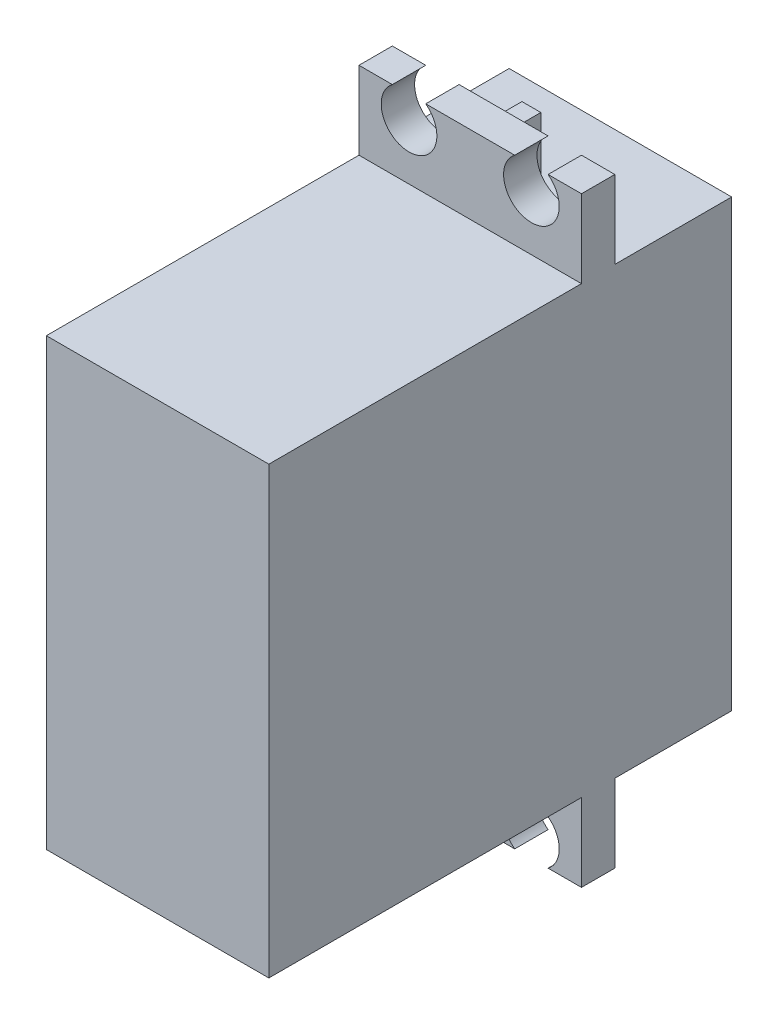
ISO-10303-21;
HEADER;
FILE_DESCRIPTION(('STEP AP214'),'2;1');
FILE_NAME('part.step','',(''),(''),'','','');
FILE_SCHEMA(('AUTOMOTIVE_DESIGN { 1 0 10303 214 1 1 1 1 }'));
ENDSEC;
DATA;
#1=APPLICATION_CONTEXT('core data for automotive mechanical design processes');
#2=APPLICATION_PROTOCOL_DEFINITION('international standard','automotive_design',2000,#1);
#3=PRODUCT_CONTEXT('',#1,'mechanical');
#4=PRODUCT('Part','Part','',(#3));
#5=PRODUCT_RELATED_PRODUCT_CATEGORY('part','',(#4));
#6=PRODUCT_DEFINITION_FORMATION('','',#4);
#7=PRODUCT_DEFINITION_CONTEXT('part definition',#1,'design');
#8=PRODUCT_DEFINITION('design','',#6,#7);
#9=PRODUCT_DEFINITION_SHAPE('','',#8);
#10=(LENGTH_UNIT() NAMED_UNIT(*) SI_UNIT(.MILLI.,.METRE.));
#11=(NAMED_UNIT(*) PLANE_ANGLE_UNIT() SI_UNIT($,.RADIAN.));
#12=(NAMED_UNIT(*) SI_UNIT($,.STERADIAN.) SOLID_ANGLE_UNIT());
#13=UNCERTAINTY_MEASURE_WITH_UNIT(LENGTH_MEASURE(1.E-05),#10,'distance_accuracy_value','');
#14=(GEOMETRIC_REPRESENTATION_CONTEXT(3) GLOBAL_UNCERTAINTY_ASSIGNED_CONTEXT((#13)) GLOBAL_UNIT_ASSIGNED_CONTEXT((#10,
#11,#12)) REPRESENTATION_CONTEXT('',''));
#15=CARTESIAN_POINT('',(0.,0.,0.));
#16=DIRECTION('',(0.,0.,1.));
#17=DIRECTION('',(1.,0.,0.));
#18=AXIS2_PLACEMENT_3D('',#15,#16,#17);
#19=CARTESIAN_POINT('',(-10.,-20.,41.6));
#20=DIRECTION('',(0.,1.,0.));
#21=DIRECTION('',(0.,0.,1.));
#22=AXIS2_PLACEMENT_3D('',#19,#20,#21);
#23=PLANE('',#22);
#24=DIRECTION('',(0.,0.,1.));
#25=VECTOR('',#24,1.);
#26=CARTESIAN_POINT('',(-0.850000000000004,-20.,8.));
#27=LINE('',#26,#25);
#28=CARTESIAN_POINT('',(-0.850000000000004,-20.,8.));
#29=VERTEX_POINT('',#28);
#30=CARTESIAN_POINT('',(-0.850000000000004,-20.,10.5));
#31=VERTEX_POINT('',#30);
#32=EDGE_CURVE('E233',#29,#31,#27,.T.);
#33=ORIENTED_EDGE('',*,*,#32,.T.);
#34=DIRECTION('',(-1.,0.,0.));
#35=VECTOR('',#34,1.);
#36=CARTESIAN_POINT('',(0.,-20.,10.5));
#37=LINE('',#36,#35);
#38=CARTESIAN_POINT('',(-10.,-20.,10.5));
#39=VERTEX_POINT('',#38);
#40=EDGE_CURVE('E293',#31,#39,#37,.T.);
#41=ORIENTED_EDGE('',*,*,#40,.T.);
#42=DIRECTION('',(0.,0.,-1.));
#43=VECTOR('',#42,1.);
#44=CARTESIAN_POINT('',(-10.,-20.,41.6));
#45=LINE('',#44,#43);
#46=CARTESIAN_POINT('',(-10.,-20.,0.));
#47=VERTEX_POINT('',#46);
#48=EDGE_CURVE('E416',#39,#47,#45,.T.);
#49=ORIENTED_EDGE('',*,*,#48,.T.);
#50=DIRECTION('',(1.,0.,0.));
#51=VECTOR('',#50,1.);
#52=CARTESIAN_POINT('',(-10.,-20.,0.));
#53=LINE('',#52,#51);
#54=CARTESIAN_POINT('',(10.,-20.,0.));
#55=VERTEX_POINT('',#54);
#56=EDGE_CURVE('E396',#47,#55,#53,.T.);
#57=ORIENTED_EDGE('',*,*,#56,.T.);
#58=DIRECTION('',(0.,0.,-1.));
#59=VECTOR('',#58,1.);
#60=CARTESIAN_POINT('',(10.,-20.,41.6));
#61=LINE('',#60,#59);
#62=CARTESIAN_POINT('',(10.,-20.,10.5));
#63=VERTEX_POINT('',#62);
#64=EDGE_CURVE('E402',#63,#55,#61,.T.);
#65=ORIENTED_EDGE('',*,*,#64,.F.);
#66=CARTESIAN_POINT('',(0.850000000000004,-20.,10.5));
#67=VERTEX_POINT('',#66);
#68=EDGE_CURVE('E294',#63,#67,#37,.T.);
#69=ORIENTED_EDGE('',*,*,#68,.T.);
#70=DIRECTION('',(0.,0.,1.));
#71=VECTOR('',#70,1.);
#72=CARTESIAN_POINT('',(0.850000000000004,-20.,8.));
#73=LINE('',#72,#71);
#74=CARTESIAN_POINT('',(0.850000000000004,-20.,8.));
#75=VERTEX_POINT('',#74);
#76=EDGE_CURVE('E240',#75,#67,#73,.T.);
#77=ORIENTED_EDGE('',*,*,#76,.F.);
#78=DIRECTION('',(1.,0.,0.));
#79=VECTOR('',#78,1.);
#80=CARTESIAN_POINT('',(-0.850000000000004,-20.,8.));
#81=LINE('',#80,#79);
#82=EDGE_CURVE('E224',#29,#75,#81,.T.);
#83=ORIENTED_EDGE('',*,*,#82,.F.);
#84=EDGE_LOOP('',(#33,#41,#49,#57,#65,#69,#77,#83));
#85=FACE_BOUND('',#84,.T.);
#86=ADVANCED_FACE('F34',(#85),#23,.F.);
#87=CARTESIAN_POINT('',(0.,0.,10.5));
#88=DIRECTION('',(0.,0.,-1.));
#89=DIRECTION('',(-1.,0.,0.));
#90=AXIS2_PLACEMENT_3D('',#87,#88,#89);
#91=PLANE('',#90);
#92=ORIENTED_EDGE('',*,*,#40,.F.);
#93=DIRECTION('',(0.,1.,0.));
#94=VECTOR('',#93,1.);
#95=CARTESIAN_POINT('',(-0.850000000000004,-20.,10.5));
#96=LINE('',#95,#94);
#97=CARTESIAN_POINT('',(-0.849999999999997,-26.,10.5));
#98=VERTEX_POINT('',#97);
#99=EDGE_CURVE('E236',#98,#31,#96,.T.);
#100=ORIENTED_EDGE('',*,*,#99,.F.);
#101=DIRECTION('',(-1.,0.,0.));
#102=VECTOR('',#101,1.);
#103=CARTESIAN_POINT('',(-0.849999999999997,-26.,10.5));
#104=LINE('',#103,#102);
#105=CARTESIAN_POINT('',(0.850000000000004,-26.,10.5));
#106=VERTEX_POINT('',#105);
#107=EDGE_CURVE('E230',#106,#98,#104,.T.);
#108=ORIENTED_EDGE('',*,*,#107,.F.);
#109=DIRECTION('',(0.,-1.,0.));
#110=VECTOR('',#109,1.);
#111=CARTESIAN_POINT('',(0.850000000000004,-20.,10.5));
#112=LINE('',#111,#110);
#113=EDGE_CURVE('E251',#67,#106,#112,.T.);
#114=ORIENTED_EDGE('',*,*,#113,.F.);
#115=ORIENTED_EDGE('',*,*,#68,.F.);
#116=DIRECTION('',(0.,1.,0.));
#117=VECTOR('',#116,1.);
#118=CARTESIAN_POINT('',(10.,0.,10.5));
#119=LINE('',#118,#117);
#120=CARTESIAN_POINT('',(10.,-27.,10.5));
#121=VERTEX_POINT('',#120);
#122=EDGE_CURVE('E296',#121,#63,#119,.T.);
#123=ORIENTED_EDGE('',*,*,#122,.F.);
#124=DIRECTION('',(-1.,0.,0.));
#125=VECTOR('',#124,1.);
#126=CARTESIAN_POINT('',(0.,-27.,10.5));
#127=LINE('',#126,#125);
#128=CARTESIAN_POINT('',(7.,-27.,10.5));
#129=VERTEX_POINT('',#128);
#130=EDGE_CURVE('E280',#121,#129,#127,.T.);
#131=ORIENTED_EDGE('',*,*,#130,.T.);
#132=CARTESIAN_POINT('',(5.5,-25.,10.5));
#133=DIRECTION('',(0.,0.,-1.));
#134=DIRECTION('',(-1.,0.,0.));
#135=AXIS2_PLACEMENT_3D('',#132,#133,#134);
#136=CIRCLE('',#135,2.5);
#137=CARTESIAN_POINT('',(4.,-27.,10.5));
#138=VERTEX_POINT('',#137);
#139=EDGE_CURVE('E283',#129,#138,#136,.F.);
#140=ORIENTED_EDGE('',*,*,#139,.T.);
#141=CARTESIAN_POINT('',(-4.,-27.,10.5));
#142=VERTEX_POINT('',#141);
#143=EDGE_CURVE('E286',#138,#142,#127,.T.);
#144=ORIENTED_EDGE('',*,*,#143,.T.);
#145=CARTESIAN_POINT('',(-5.5,-25.,10.5));
#146=DIRECTION('',(0.,0.,-1.));
#147=DIRECTION('',(-1.,0.,0.));
#148=AXIS2_PLACEMENT_3D('',#145,#146,#147);
#149=CIRCLE('',#148,2.5);
#150=CARTESIAN_POINT('',(-7.,-27.,10.5));
#151=VERTEX_POINT('',#150);
#152=EDGE_CURVE('E288',#142,#151,#149,.F.);
#153=ORIENTED_EDGE('',*,*,#152,.T.);
#154=CARTESIAN_POINT('',(-10.,-27.,10.5));
#155=VERTEX_POINT('',#154);
#156=EDGE_CURVE('E285',#151,#155,#127,.T.);
#157=ORIENTED_EDGE('',*,*,#156,.T.);
#158=DIRECTION('',(0.,1.,0.));
#159=VECTOR('',#158,1.);
#160=CARTESIAN_POINT('',(-10.,0.,10.5));
#161=LINE('',#160,#159);
#162=EDGE_CURVE('E290',#155,#39,#161,.T.);
#163=ORIENTED_EDGE('',*,*,#162,.T.);
#164=EDGE_LOOP('',(#92,#100,#108,#114,#115,#123,#131,#140,#144,#153,#157,#163));
#165=FACE_BOUND('',#164,.T.);
#166=ADVANCED_FACE('F501',(#165),#91,.T.);
#167=CARTESIAN_POINT('',(-10.,20.,41.6));
#168=DIRECTION('',(0.,-1.,0.));
#169=DIRECTION('',(0.,0.,-1.));
#170=AXIS2_PLACEMENT_3D('',#167,#168,#169);
#171=PLANE('',#170);
#172=DIRECTION('',(0.,0.,1.));
#173=VECTOR('',#172,1.);
#174=CARTESIAN_POINT('',(0.850000000000001,20.,8.));
#175=LINE('',#174,#173);
#176=CARTESIAN_POINT('',(0.850000000000001,20.,8.));
#177=VERTEX_POINT('',#176);
#178=CARTESIAN_POINT('',(0.850000000000001,20.,10.5));
#179=VERTEX_POINT('',#178);
#180=EDGE_CURVE('E276',#177,#179,#175,.T.);
#181=ORIENTED_EDGE('',*,*,#180,.T.);
#182=DIRECTION('',(1.,0.,0.));
#183=VECTOR('',#182,1.);
#184=CARTESIAN_POINT('',(0.,20.,10.5));
#185=LINE('',#184,#183);
#186=CARTESIAN_POINT('',(10.,20.,10.5));
#187=VERTEX_POINT('',#186);
#188=EDGE_CURVE('E346',#179,#187,#185,.T.);
#189=ORIENTED_EDGE('',*,*,#188,.T.);
#190=DIRECTION('',(0.,0.,-1.));
#191=VECTOR('',#190,1.);
#192=CARTESIAN_POINT('',(10.,20.,41.6));
#193=LINE('',#192,#191);
#194=CARTESIAN_POINT('',(10.,20.,0.));
#195=VERTEX_POINT('',#194);
#196=EDGE_CURVE('E423',#187,#195,#193,.T.);
#197=ORIENTED_EDGE('',*,*,#196,.T.);
#198=DIRECTION('',(-1.,0.,0.));
#199=VECTOR('',#198,1.);
#200=CARTESIAN_POINT('',(-10.,20.,0.));
#201=LINE('',#200,#199);
#202=CARTESIAN_POINT('',(-10.,20.,0.));
#203=VERTEX_POINT('',#202);
#204=EDGE_CURVE('E405',#195,#203,#201,.T.);
#205=ORIENTED_EDGE('',*,*,#204,.T.);
#206=DIRECTION('',(0.,0.,-1.));
#207=VECTOR('',#206,1.);
#208=CARTESIAN_POINT('',(-10.,20.,41.6));
#209=LINE('',#208,#207);
#210=CARTESIAN_POINT('',(-10.,20.,10.5));
#211=VERTEX_POINT('',#210);
#212=EDGE_CURVE('E420',#211,#203,#209,.T.);
#213=ORIENTED_EDGE('',*,*,#212,.F.);
#214=CARTESIAN_POINT('',(-0.850000000000001,20.,10.5));
#215=VERTEX_POINT('',#214);
#216=EDGE_CURVE('E347',#211,#215,#185,.T.);
#217=ORIENTED_EDGE('',*,*,#216,.T.);
#218=DIRECTION('',(0.,0.,1.));
#219=VECTOR('',#218,1.);
#220=CARTESIAN_POINT('',(-0.850000000000001,20.,8.));
#221=LINE('',#220,#219);
#222=CARTESIAN_POINT('',(-0.850000000000001,20.,8.));
#223=VERTEX_POINT('',#222);
#224=EDGE_CURVE('E274',#223,#215,#221,.T.);
#225=ORIENTED_EDGE('',*,*,#224,.F.);
#226=DIRECTION('',(-1.,0.,0.));
#227=VECTOR('',#226,1.);
#228=CARTESIAN_POINT('',(0.850000000000001,20.,8.));
#229=LINE('',#228,#227);
#230=EDGE_CURVE('E259',#177,#223,#229,.T.);
#231=ORIENTED_EDGE('',*,*,#230,.F.);
#232=EDGE_LOOP('',(#181,#189,#197,#205,#213,#217,#225,#231));
#233=FACE_BOUND('',#232,.T.);
#234=ADVANCED_FACE('F431',(#233),#171,.F.);
#235=CARTESIAN_POINT('',(0.,0.,10.5));
#236=DIRECTION('',(0.,0.,-1.));
#237=DIRECTION('',(-1.,0.,0.));
#238=AXIS2_PLACEMENT_3D('',#235,#236,#237);
#239=PLANE('',#238);
#240=ORIENTED_EDGE('',*,*,#188,.F.);
#241=DIRECTION('',(0.,-1.,0.));
#242=VECTOR('',#241,1.);
#243=CARTESIAN_POINT('',(0.85,26.,10.5));
#244=LINE('',#243,#242);
#245=CARTESIAN_POINT('',(0.85,26.,10.5));
#246=VERTEX_POINT('',#245);
#247=EDGE_CURVE('E239',#246,#179,#244,.T.);
#248=ORIENTED_EDGE('',*,*,#247,.F.);
#249=DIRECTION('',(1.,0.,0.));
#250=VECTOR('',#249,1.);
#251=CARTESIAN_POINT('',(0.85,26.,10.5));
#252=LINE('',#251,#250);
#253=CARTESIAN_POINT('',(-0.85,26.,10.5));
#254=VERTEX_POINT('',#253);
#255=EDGE_CURVE('E260',#254,#246,#252,.T.);
#256=ORIENTED_EDGE('',*,*,#255,.F.);
#257=DIRECTION('',(0.,1.,0.));
#258=VECTOR('',#257,1.);
#259=CARTESIAN_POINT('',(-0.85,26.,10.5));
#260=LINE('',#259,#258);
#261=EDGE_CURVE('E268',#215,#254,#260,.T.);
#262=ORIENTED_EDGE('',*,*,#261,.F.);
#263=ORIENTED_EDGE('',*,*,#216,.F.);
#264=DIRECTION('',(0.,1.,0.));
#265=VECTOR('',#264,1.);
#266=CARTESIAN_POINT('',(-10.,0.,10.5));
#267=LINE('',#266,#265);
#268=CARTESIAN_POINT('',(-10.,27.,10.5));
#269=VERTEX_POINT('',#268);
#270=EDGE_CURVE('E350',#211,#269,#267,.T.);
#271=ORIENTED_EDGE('',*,*,#270,.T.);
#272=DIRECTION('',(-1.,0.,0.));
#273=VECTOR('',#272,1.);
#274=CARTESIAN_POINT('',(0.,27.,10.5));
#275=LINE('',#274,#273);
#276=CARTESIAN_POINT('',(-7.,27.,10.5));
#277=VERTEX_POINT('',#276);
#278=EDGE_CURVE('E339',#277,#269,#275,.T.);
#279=ORIENTED_EDGE('',*,*,#278,.F.);
#280=CARTESIAN_POINT('',(-5.5,25.,10.5));
#281=DIRECTION('',(0.,0.,-1.));
#282=DIRECTION('',(-1.,0.,0.));
#283=AXIS2_PLACEMENT_3D('',#280,#281,#282);
#284=CIRCLE('',#283,2.5);
#285=CARTESIAN_POINT('',(-4.,27.,10.5));
#286=VERTEX_POINT('',#285);
#287=EDGE_CURVE('E331',#286,#277,#284,.T.);
#288=ORIENTED_EDGE('',*,*,#287,.F.);
#289=CARTESIAN_POINT('',(4.,27.,10.5));
#290=VERTEX_POINT('',#289);
#291=EDGE_CURVE('E334',#290,#286,#275,.T.);
#292=ORIENTED_EDGE('',*,*,#291,.F.);
#293=CARTESIAN_POINT('',(5.5,25.,10.5));
#294=DIRECTION('',(0.,0.,-1.));
#295=DIRECTION('',(-1.,0.,0.));
#296=AXIS2_PLACEMENT_3D('',#293,#294,#295);
#297=CIRCLE('',#296,2.5);
#298=CARTESIAN_POINT('',(7.,27.,10.5));
#299=VERTEX_POINT('',#298);
#300=EDGE_CURVE('E338',#299,#290,#297,.T.);
#301=ORIENTED_EDGE('',*,*,#300,.F.);
#302=CARTESIAN_POINT('',(10.,27.,10.5));
#303=VERTEX_POINT('',#302);
#304=EDGE_CURVE('E340',#303,#299,#275,.T.);
#305=ORIENTED_EDGE('',*,*,#304,.F.);
#306=DIRECTION('',(0.,1.,0.));
#307=VECTOR('',#306,1.);
#308=CARTESIAN_POINT('',(10.,0.,10.5));
#309=LINE('',#308,#307);
#310=EDGE_CURVE('E343',#187,#303,#309,.T.);
#311=ORIENTED_EDGE('',*,*,#310,.F.);
#312=EDGE_LOOP('',(#240,#248,#256,#262,#263,#271,#279,#288,#292,#301,#305,#311));
#313=FACE_BOUND('',#312,.T.);
#314=ADVANCED_FACE('F453',(#313),#239,.T.);
#315=DIRECTION('',(-1.,0.,0.));
#316=VECTOR('',#315,1.);
#317=CARTESIAN_POINT('',(0.,-20.,13.5));
#318=LINE('',#317,#316);
#319=CARTESIAN_POINT('',(10.,-20.,13.5));
#320=VERTEX_POINT('',#319);
#321=CARTESIAN_POINT('',(-10.,-20.,13.5));
#322=VERTEX_POINT('',#321);
#323=EDGE_CURVE('E310',#320,#322,#318,.T.);
#324=ORIENTED_EDGE('',*,*,#323,.F.);
#325=CARTESIAN_POINT('',(10.,-20.,41.6));
#326=VERTEX_POINT('',#325);
#327=EDGE_CURVE('E413',#326,#320,#61,.T.);
#328=ORIENTED_EDGE('',*,*,#327,.F.);
#329=DIRECTION('',(1.,0.,0.));
#330=VECTOR('',#329,1.);
#331=CARTESIAN_POINT('',(-10.,-20.,41.6));
#332=LINE('',#331,#330);
#333=CARTESIAN_POINT('',(-10.,-20.,41.6));
#334=VERTEX_POINT('',#333);
#335=EDGE_CURVE('E400',#334,#326,#332,.T.);
#336=ORIENTED_EDGE('',*,*,#335,.F.);
#337=EDGE_CURVE('E417',#334,#322,#45,.T.);
#338=ORIENTED_EDGE('',*,*,#337,.T.);
#339=EDGE_LOOP('',(#324,#328,#336,#338));
#340=FACE_BOUND('',#339,.T.);
#341=ADVANCED_FACE('F489',(#340),#23,.F.);
#342=DIRECTION('',(1.,0.,0.));
#343=VECTOR('',#342,1.);
#344=CARTESIAN_POINT('',(0.,20.,13.5));
#345=LINE('',#344,#343);
#346=CARTESIAN_POINT('',(-10.,20.,13.5));
#347=VERTEX_POINT('',#346);
#348=CARTESIAN_POINT('',(10.,20.,13.5));
#349=VERTEX_POINT('',#348);
#350=EDGE_CURVE('E364',#347,#349,#345,.T.);
#351=ORIENTED_EDGE('',*,*,#350,.F.);
#352=CARTESIAN_POINT('',(-10.,20.,41.6));
#353=VERTEX_POINT('',#352);
#354=EDGE_CURVE('E421',#353,#347,#209,.T.);
#355=ORIENTED_EDGE('',*,*,#354,.F.);
#356=DIRECTION('',(-1.,0.,0.));
#357=VECTOR('',#356,1.);
#358=CARTESIAN_POINT('',(-10.,20.,41.6));
#359=LINE('',#358,#357);
#360=CARTESIAN_POINT('',(10.,20.,41.6));
#361=VERTEX_POINT('',#360);
#362=EDGE_CURVE('E395',#361,#353,#359,.T.);
#363=ORIENTED_EDGE('',*,*,#362,.F.);
#364=EDGE_CURVE('E42',#361,#349,#193,.T.);
#365=ORIENTED_EDGE('',*,*,#364,.T.);
#366=EDGE_LOOP('',(#351,#355,#363,#365));
#367=FACE_BOUND('',#366,.T.);
#368=ADVANCED_FACE('F478',(#367),#171,.F.);
#369=CARTESIAN_POINT('',(10.,-20.,41.6));
#370=DIRECTION('',(-1.,0.,0.));
#371=DIRECTION('',(0.,0.,1.));
#372=AXIS2_PLACEMENT_3D('',#369,#370,#371);
#373=PLANE('',#372);
#374=DIRECTION('',(0.,1.,0.));
#375=VECTOR('',#374,1.);
#376=CARTESIAN_POINT('',(10.,-20.,0.));
#377=LINE('',#376,#375);
#378=EDGE_CURVE('E389',#55,#195,#377,.T.);
#379=ORIENTED_EDGE('',*,*,#378,.T.);
#380=ORIENTED_EDGE('',*,*,#196,.F.);
#381=ORIENTED_EDGE('',*,*,#310,.T.);
#382=DIRECTION('',(0.,0.,1.));
#383=VECTOR('',#382,1.);
#384=CARTESIAN_POINT('',(10.,27.,10.5));
#385=LINE('',#384,#383);
#386=CARTESIAN_POINT('',(10.,27.,13.5));
#387=VERTEX_POINT('',#386);
#388=EDGE_CURVE('E374',#303,#387,#385,.T.);
#389=ORIENTED_EDGE('',*,*,#388,.T.);
#390=DIRECTION('',(0.,1.,0.));
#391=VECTOR('',#390,1.);
#392=CARTESIAN_POINT('',(10.,0.,13.5));
#393=LINE('',#392,#391);
#394=EDGE_CURVE('E361',#349,#387,#393,.T.);
#395=ORIENTED_EDGE('',*,*,#394,.F.);
#396=ORIENTED_EDGE('',*,*,#364,.F.);
#397=DIRECTION('',(0.,1.,0.));
#398=VECTOR('',#397,1.);
#399=CARTESIAN_POINT('',(10.,-20.,41.6));
#400=LINE('',#399,#398);
#401=EDGE_CURVE('E392',#326,#361,#400,.T.);
#402=ORIENTED_EDGE('',*,*,#401,.F.);
#403=ORIENTED_EDGE('',*,*,#327,.T.);
#404=DIRECTION('',(0.,1.,0.));
#405=VECTOR('',#404,1.);
#406=CARTESIAN_POINT('',(10.,0.,13.5));
#407=LINE('',#406,#405);
#408=CARTESIAN_POINT('',(10.,-27.,13.5));
#409=VERTEX_POINT('',#408);
#410=EDGE_CURVE('E284',#409,#320,#407,.T.);
#411=ORIENTED_EDGE('',*,*,#410,.F.);
#412=DIRECTION('',(0.,0.,1.));
#413=VECTOR('',#412,1.);
#414=CARTESIAN_POINT('',(10.,-27.,10.5));
#415=LINE('',#414,#413);
#416=EDGE_CURVE('E299',#121,#409,#415,.T.);
#417=ORIENTED_EDGE('',*,*,#416,.F.);
#418=ORIENTED_EDGE('',*,*,#122,.T.);
#419=ORIENTED_EDGE('',*,*,#64,.T.);
#420=EDGE_LOOP('',(#379,#380,#381,#389,#395,#396,#402,#403,#411,#417,#418,#419));
#421=FACE_BOUND('',#420,.T.);
#422=ADVANCED_FACE('F36',(#421),#373,.F.);
#423=CARTESIAN_POINT('',(-10.,-20.,41.6));
#424=DIRECTION('',(1.,0.,0.));
#425=DIRECTION('',(0.,0.,-1.));
#426=AXIS2_PLACEMENT_3D('',#423,#424,#425);
#427=PLANE('',#426);
#428=DIRECTION('',(0.,-1.,0.));
#429=VECTOR('',#428,1.);
#430=CARTESIAN_POINT('',(-10.,-20.,0.));
#431=LINE('',#430,#429);
#432=EDGE_CURVE('E408',#203,#47,#431,.T.);
#433=ORIENTED_EDGE('',*,*,#432,.T.);
#434=ORIENTED_EDGE('',*,*,#48,.F.);
#435=ORIENTED_EDGE('',*,*,#162,.F.);
#436=DIRECTION('',(0.,0.,1.));
#437=VECTOR('',#436,1.);
#438=CARTESIAN_POINT('',(-10.,-27.,10.5));
#439=LINE('',#438,#437);
#440=CARTESIAN_POINT('',(-10.,-27.,13.5));
#441=VERTEX_POINT('',#440);
#442=EDGE_CURVE('E315',#155,#441,#439,.T.);
#443=ORIENTED_EDGE('',*,*,#442,.T.);
#444=DIRECTION('',(0.,1.,0.));
#445=VECTOR('',#444,1.);
#446=CARTESIAN_POINT('',(-10.,0.,13.5));
#447=LINE('',#446,#445);
#448=EDGE_CURVE('E308',#441,#322,#447,.T.);
#449=ORIENTED_EDGE('',*,*,#448,.T.);
#450=ORIENTED_EDGE('',*,*,#337,.F.);
#451=DIRECTION('',(0.,-1.,0.));
#452=VECTOR('',#451,1.);
#453=CARTESIAN_POINT('',(-10.,-20.,41.6));
#454=LINE('',#453,#452);
#455=EDGE_CURVE('E398',#353,#334,#454,.T.);
#456=ORIENTED_EDGE('',*,*,#455,.F.);
#457=ORIENTED_EDGE('',*,*,#354,.T.);
#458=DIRECTION('',(0.,1.,0.));
#459=VECTOR('',#458,1.);
#460=CARTESIAN_POINT('',(-10.,0.,13.5));
#461=LINE('',#460,#459);
#462=CARTESIAN_POINT('',(-10.,27.,13.5));
#463=VERTEX_POINT('',#462);
#464=EDGE_CURVE('E367',#347,#463,#461,.T.);
#465=ORIENTED_EDGE('',*,*,#464,.T.);
#466=DIRECTION('',(0.,0.,1.));
#467=VECTOR('',#466,1.);
#468=CARTESIAN_POINT('',(-10.,27.,10.5));
#469=LINE('',#468,#467);
#470=EDGE_CURVE('E372',#269,#463,#469,.T.);
#471=ORIENTED_EDGE('',*,*,#470,.F.);
#472=ORIENTED_EDGE('',*,*,#270,.F.);
#473=ORIENTED_EDGE('',*,*,#212,.T.);
#474=EDGE_LOOP('',(#433,#434,#435,#443,#449,#450,#456,#457,#465,#471,#472,#473));
#475=FACE_BOUND('',#474,.T.);
#476=ADVANCED_FACE('F446',(#475),#427,.F.);
#477=CARTESIAN_POINT('',(0.,0.,41.6));
#478=DIRECTION('',(0.,0.,-1.));
#479=DIRECTION('',(-1.,0.,0.));
#480=AXIS2_PLACEMENT_3D('',#477,#478,#479);
#481=PLANE('',#480);
#482=ORIENTED_EDGE('',*,*,#401,.T.);
#483=ORIENTED_EDGE('',*,*,#362,.T.);
#484=ORIENTED_EDGE('',*,*,#455,.T.);
#485=ORIENTED_EDGE('',*,*,#335,.T.);
#486=EDGE_LOOP('',(#482,#483,#484,#485));
#487=FACE_BOUND('',#486,.T.);
#488=ADVANCED_FACE('F483',(#487),#481,.F.);
#489=CARTESIAN_POINT('',(0.,0.,0.));
#490=DIRECTION('',(0.,0.,-1.));
#491=DIRECTION('',(-1.,0.,0.));
#492=AXIS2_PLACEMENT_3D('',#489,#490,#491);
#493=PLANE('',#492);
#494=CARTESIAN_POINT('',(0.,10.,0.));
#495=DIRECTION('',(0.,0.,-1.));
#496=DIRECTION('',(-1.,0.,0.));
#497=AXIS2_PLACEMENT_3D('',#494,#495,#496);
#498=CIRCLE('',#497,3.);
#499=CARTESIAN_POINT('',(-3.,10.,0.));
#500=VERTEX_POINT('',#499);
#501=EDGE_CURVE('E385',#500,#500,#498,.T.);
#502=ORIENTED_EDGE('',*,*,#501,.F.);
#503=EDGE_LOOP('',(#502));
#504=FACE_BOUND('',#503,.T.);
#505=ORIENTED_EDGE('',*,*,#378,.F.);
#506=ORIENTED_EDGE('',*,*,#56,.F.);
#507=ORIENTED_EDGE('',*,*,#432,.F.);
#508=ORIENTED_EDGE('',*,*,#204,.F.);
#509=EDGE_LOOP('',(#505,#506,#507,#508));
#510=FACE_BOUND('',#509,.T.);
#511=ADVANCED_FACE('F439',(#504,#510),#493,.T.);
#512=CARTESIAN_POINT('',(0.,10.,-4.));
#513=DIRECTION('',(0.,0.,-1.));
#514=DIRECTION('',(-1.,0.,0.));
#515=AXIS2_PLACEMENT_3D('',#512,#513,#514);
#516=PLANE('',#515);
#517=CARTESIAN_POINT('',(0.,10.,-4.));
#518=DIRECTION('',(0.,0.,-1.));
#519=DIRECTION('',(-1.,0.,0.));
#520=AXIS2_PLACEMENT_3D('',#517,#518,#519);
#521=CIRCLE('',#520,3.);
#522=CARTESIAN_POINT('',(-3.,10.,-4.));
#523=VERTEX_POINT('',#522);
#524=EDGE_CURVE('E386',#523,#523,#521,.T.);
#525=ORIENTED_EDGE('',*,*,#524,.T.);
#526=EDGE_LOOP('',(#525));
#527=FACE_BOUND('',#526,.T.);
#528=CARTESIAN_POINT('',(0.,10.,-4.));
#529=DIRECTION('',(0.,0.,-1.));
#530=DIRECTION('',(-1.,0.,0.));
#531=AXIS2_PLACEMENT_3D('',#528,#529,#530);
#532=CIRCLE('',#531,1.5);
#533=CARTESIAN_POINT('',(-1.5,10.,-4.));
#534=VERTEX_POINT('',#533);
#535=EDGE_CURVE('E382',#534,#534,#532,.T.);
#536=ORIENTED_EDGE('',*,*,#535,.F.);
#537=EDGE_LOOP('',(#536));
#538=FACE_BOUND('',#537,.T.);
#539=ADVANCED_FACE('F570',(#527,#538),#516,.T.);
#540=CARTESIAN_POINT('',(0.,10.,-4.));
#541=DIRECTION('',(0.,0.,1.));
#542=DIRECTION('',(1.,0.,0.));
#543=AXIS2_PLACEMENT_3D('',#540,#541,#542);
#544=CYLINDRICAL_SURFACE('',#543,3.);
#545=ORIENTED_EDGE('',*,*,#524,.F.);
#546=EDGE_LOOP('',(#545));
#547=FACE_BOUND('',#546,.T.);
#548=ORIENTED_EDGE('',*,*,#501,.T.);
#549=EDGE_LOOP('',(#548));
#550=FACE_BOUND('',#549,.T.);
#551=ADVANCED_FACE('F568',(#547,#550),#544,.T.);
#552=CARTESIAN_POINT('',(0.,10.,-4.));
#553=DIRECTION('',(0.,0.,1.));
#554=DIRECTION('',(1.,0.,0.));
#555=AXIS2_PLACEMENT_3D('',#552,#553,#554);
#556=CYLINDRICAL_SURFACE('',#555,1.5);
#557=ORIENTED_EDGE('',*,*,#535,.T.);
#558=EDGE_LOOP('',(#557));
#559=FACE_BOUND('',#558,.T.);
#560=CARTESIAN_POINT('',(0.,10.,0.));
#561=DIRECTION('',(0.,0.,-1.));
#562=DIRECTION('',(-1.,0.,0.));
#563=AXIS2_PLACEMENT_3D('',#560,#561,#562);
#564=CIRCLE('',#563,1.5);
#565=CARTESIAN_POINT('',(-1.5,10.,0.));
#566=VERTEX_POINT('',#565);
#567=EDGE_CURVE('E11',#566,#566,#564,.F.);
#568=ORIENTED_EDGE('',*,*,#567,.T.);
#569=EDGE_LOOP('',(#568));
#570=FACE_BOUND('',#569,.T.);
#571=ADVANCED_FACE('F565',(#559,#570),#556,.F.);
#572=ORIENTED_EDGE('',*,*,#567,.F.);
#573=EDGE_LOOP('',(#572));
#574=FACE_BOUND('',#573,.T.);
#575=ADVANCED_FACE('F563',(#574),#493,.T.);
#576=CARTESIAN_POINT('',(-5.5,25.,10.5));
#577=DIRECTION('',(0.,0.,1.));
#578=DIRECTION('',(1.,0.,0.));
#579=AXIS2_PLACEMENT_3D('',#576,#577,#578);
#580=CYLINDRICAL_SURFACE('',#579,2.5);
#581=CARTESIAN_POINT('',(-5.5,25.,13.5));
#582=DIRECTION('',(0.,0.,-1.));
#583=DIRECTION('',(-1.,0.,0.));
#584=AXIS2_PLACEMENT_3D('',#581,#582,#583);
#585=CIRCLE('',#584,2.5);
#586=CARTESIAN_POINT('',(-4.,27.,13.5));
#587=VERTEX_POINT('',#586);
#588=CARTESIAN_POINT('',(-7.,27.,13.5));
#589=VERTEX_POINT('',#588);
#590=EDGE_CURVE('E330',#587,#589,#585,.T.);
#591=ORIENTED_EDGE('',*,*,#590,.F.);
#592=DIRECTION('',(0.,0.,1.));
#593=VECTOR('',#592,1.);
#594=CARTESIAN_POINT('',(-4.,27.,10.5));
#595=LINE('',#594,#593);
#596=EDGE_CURVE('E380',#286,#587,#595,.T.);
#597=ORIENTED_EDGE('',*,*,#596,.F.);
#598=ORIENTED_EDGE('',*,*,#287,.T.);
#599=DIRECTION('',(0.,0.,1.));
#600=VECTOR('',#599,1.);
#601=CARTESIAN_POINT('',(-7.,27.,10.5));
#602=LINE('',#601,#600);
#603=EDGE_CURVE('E370',#277,#589,#602,.T.);
#604=ORIENTED_EDGE('',*,*,#603,.T.);
#605=EDGE_LOOP('',(#591,#597,#598,#604));
#606=FACE_BOUND('',#605,.T.);
#607=ADVANCED_FACE('F560',(#606),#580,.F.);
#608=CARTESIAN_POINT('',(0.,27.,10.5));
#609=DIRECTION('',(0.,1.,0.));
#610=DIRECTION('',(0.,0.,1.));
#611=AXIS2_PLACEMENT_3D('',#608,#609,#610);
#612=PLANE('',#611);
#613=DIRECTION('',(-1.,0.,0.));
#614=VECTOR('',#613,1.);
#615=CARTESIAN_POINT('',(0.,27.,13.5));
#616=LINE('',#615,#614);
#617=CARTESIAN_POINT('',(4.,27.,13.5));
#618=VERTEX_POINT('',#617);
#619=EDGE_CURVE('E354',#618,#587,#616,.T.);
#620=ORIENTED_EDGE('',*,*,#619,.F.);
#621=DIRECTION('',(0.,0.,1.));
#622=VECTOR('',#621,1.);
#623=CARTESIAN_POINT('',(4.,27.,10.5));
#624=LINE('',#623,#622);
#625=EDGE_CURVE('E378',#290,#618,#624,.T.);
#626=ORIENTED_EDGE('',*,*,#625,.F.);
#627=ORIENTED_EDGE('',*,*,#291,.T.);
#628=ORIENTED_EDGE('',*,*,#596,.T.);
#629=EDGE_LOOP('',(#620,#626,#627,#628));
#630=FACE_BOUND('',#629,.T.);
#631=ADVANCED_FACE('F555',(#630),#612,.T.);
#632=CARTESIAN_POINT('',(5.5,25.,10.5));
#633=DIRECTION('',(0.,0.,1.));
#634=DIRECTION('',(1.,0.,0.));
#635=AXIS2_PLACEMENT_3D('',#632,#633,#634);
#636=CYLINDRICAL_SURFACE('',#635,2.5);
#637=CARTESIAN_POINT('',(5.5,25.,13.5));
#638=DIRECTION('',(0.,0.,-1.));
#639=DIRECTION('',(-1.,0.,0.));
#640=AXIS2_PLACEMENT_3D('',#637,#638,#639);
#641=CIRCLE('',#640,2.5);
#642=CARTESIAN_POINT('',(7.,27.,13.5));
#643=VERTEX_POINT('',#642);
#644=EDGE_CURVE('E357',#643,#618,#641,.T.);
#645=ORIENTED_EDGE('',*,*,#644,.F.);
#646=DIRECTION('',(0.,0.,1.));
#647=VECTOR('',#646,1.);
#648=CARTESIAN_POINT('',(7.,27.,10.5));
#649=LINE('',#648,#647);
#650=EDGE_CURVE('E376',#299,#643,#649,.T.);
#651=ORIENTED_EDGE('',*,*,#650,.F.);
#652=ORIENTED_EDGE('',*,*,#300,.T.);
#653=ORIENTED_EDGE('',*,*,#625,.T.);
#654=EDGE_LOOP('',(#645,#651,#652,#653));
#655=FACE_BOUND('',#654,.T.);
#656=ADVANCED_FACE('F556',(#655),#636,.F.);
#657=EDGE_CURVE('E358',#387,#643,#616,.T.);
#658=ORIENTED_EDGE('',*,*,#657,.F.);
#659=ORIENTED_EDGE('',*,*,#388,.F.);
#660=ORIENTED_EDGE('',*,*,#304,.T.);
#661=ORIENTED_EDGE('',*,*,#650,.T.);
#662=EDGE_LOOP('',(#658,#659,#660,#661));
#663=FACE_BOUND('',#662,.T.);
#664=ADVANCED_FACE('F472',(#663),#612,.T.);
#665=EDGE_CURVE('E335',#589,#463,#616,.T.);
#666=ORIENTED_EDGE('',*,*,#665,.F.);
#667=ORIENTED_EDGE('',*,*,#603,.F.);
#668=ORIENTED_EDGE('',*,*,#278,.T.);
#669=ORIENTED_EDGE('',*,*,#470,.T.);
#670=EDGE_LOOP('',(#666,#667,#668,#669));
#671=FACE_BOUND('',#670,.T.);
#672=ADVANCED_FACE('F551',(#671),#612,.T.);
#673=CARTESIAN_POINT('',(0.,0.,13.5));
#674=DIRECTION('',(0.,0.,-1.));
#675=DIRECTION('',(-1.,0.,0.));
#676=AXIS2_PLACEMENT_3D('',#673,#674,#675);
#677=PLANE('',#676);
#678=ORIENTED_EDGE('',*,*,#590,.T.);
#679=ORIENTED_EDGE('',*,*,#665,.T.);
#680=ORIENTED_EDGE('',*,*,#464,.F.);
#681=ORIENTED_EDGE('',*,*,#350,.T.);
#682=ORIENTED_EDGE('',*,*,#394,.T.);
#683=ORIENTED_EDGE('',*,*,#657,.T.);
#684=ORIENTED_EDGE('',*,*,#644,.T.);
#685=ORIENTED_EDGE('',*,*,#619,.T.);
#686=EDGE_LOOP('',(#678,#679,#680,#681,#682,#683,#684,#685));
#687=FACE_BOUND('',#686,.T.);
#688=ADVANCED_FACE('F475',(#687),#677,.F.);
#689=CARTESIAN_POINT('',(0.,-27.,10.5));
#690=DIRECTION('',(0.,1.,0.));
#691=DIRECTION('',(0.,0.,1.));
#692=AXIS2_PLACEMENT_3D('',#689,#690,#691);
#693=PLANE('',#692);
#694=DIRECTION('',(-1.,0.,0.));
#695=VECTOR('',#694,1.);
#696=CARTESIAN_POINT('',(0.,-27.,13.5));
#697=LINE('',#696,#695);
#698=CARTESIAN_POINT('',(7.,-27.,13.5));
#699=VERTEX_POINT('',#698);
#700=EDGE_CURVE('E279',#409,#699,#697,.T.);
#701=ORIENTED_EDGE('',*,*,#700,.T.);
#702=DIRECTION('',(0.,0.,1.));
#703=VECTOR('',#702,1.);
#704=CARTESIAN_POINT('',(7.,-27.,10.5));
#705=LINE('',#704,#703);
#706=EDGE_CURVE('E327',#129,#699,#705,.T.);
#707=ORIENTED_EDGE('',*,*,#706,.F.);
#708=ORIENTED_EDGE('',*,*,#130,.F.);
#709=ORIENTED_EDGE('',*,*,#416,.T.);
#710=EDGE_LOOP('',(#701,#707,#708,#709));
#711=FACE_BOUND('',#710,.T.);
#712=ADVANCED_FACE('F498',(#711),#693,.F.);
#713=CARTESIAN_POINT('',(5.5,-25.,10.5));
#714=DIRECTION('',(0.,0.,1.));
#715=DIRECTION('',(1.,0.,0.));
#716=AXIS2_PLACEMENT_3D('',#713,#714,#715);
#717=CYLINDRICAL_SURFACE('',#716,2.5);
#718=CARTESIAN_POINT('',(5.5,-25.,13.5));
#719=DIRECTION('',(0.,0.,-1.));
#720=DIRECTION('',(-1.,0.,0.));
#721=AXIS2_PLACEMENT_3D('',#718,#719,#720);
#722=CIRCLE('',#721,2.5);
#723=CARTESIAN_POINT('',(4.,-27.,13.5));
#724=VERTEX_POINT('',#723);
#725=EDGE_CURVE('E302',#699,#724,#722,.F.);
#726=ORIENTED_EDGE('',*,*,#725,.T.);
#727=DIRECTION('',(0.,0.,1.));
#728=VECTOR('',#727,1.);
#729=CARTESIAN_POINT('',(4.,-27.,10.5));
#730=LINE('',#729,#728);
#731=EDGE_CURVE('E324',#138,#724,#730,.T.);
#732=ORIENTED_EDGE('',*,*,#731,.F.);
#733=ORIENTED_EDGE('',*,*,#139,.F.);
#734=ORIENTED_EDGE('',*,*,#706,.T.);
#735=EDGE_LOOP('',(#726,#732,#733,#734));
#736=FACE_BOUND('',#735,.T.);
#737=ADVANCED_FACE('F522',(#736),#717,.F.);
#738=CARTESIAN_POINT('',(-4.,-27.,13.5));
#739=VERTEX_POINT('',#738);
#740=EDGE_CURVE('E304',#724,#739,#697,.T.);
#741=ORIENTED_EDGE('',*,*,#740,.T.);
#742=DIRECTION('',(0.,0.,1.));
#743=VECTOR('',#742,1.);
#744=CARTESIAN_POINT('',(-4.,-27.,10.5));
#745=LINE('',#744,#743);
#746=EDGE_CURVE('E321',#142,#739,#745,.T.);
#747=ORIENTED_EDGE('',*,*,#746,.F.);
#748=ORIENTED_EDGE('',*,*,#143,.F.);
#749=ORIENTED_EDGE('',*,*,#731,.T.);
#750=EDGE_LOOP('',(#741,#747,#748,#749));
#751=FACE_BOUND('',#750,.T.);
#752=ADVANCED_FACE('F515',(#751),#693,.F.);
#753=CARTESIAN_POINT('',(-5.5,-25.,10.5));
#754=DIRECTION('',(0.,0.,1.));
#755=DIRECTION('',(1.,0.,0.));
#756=AXIS2_PLACEMENT_3D('',#753,#754,#755);
#757=CYLINDRICAL_SURFACE('',#756,2.5);
#758=CARTESIAN_POINT('',(-5.5,-25.,13.5));
#759=DIRECTION('',(0.,0.,-1.));
#760=DIRECTION('',(-1.,0.,0.));
#761=AXIS2_PLACEMENT_3D('',#758,#759,#760);
#762=CIRCLE('',#761,2.5);
#763=CARTESIAN_POINT('',(-7.,-27.,13.5));
#764=VERTEX_POINT('',#763);
#765=EDGE_CURVE('E306',#739,#764,#762,.F.);
#766=ORIENTED_EDGE('',*,*,#765,.T.);
#767=DIRECTION('',(0.,0.,1.));
#768=VECTOR('',#767,1.);
#769=CARTESIAN_POINT('',(-7.,-27.,10.5));
#770=LINE('',#769,#768);
#771=EDGE_CURVE('E318',#151,#764,#770,.T.);
#772=ORIENTED_EDGE('',*,*,#771,.F.);
#773=ORIENTED_EDGE('',*,*,#152,.F.);
#774=ORIENTED_EDGE('',*,*,#746,.T.);
#775=EDGE_LOOP('',(#766,#772,#773,#774));
#776=FACE_BOUND('',#775,.T.);
#777=ADVANCED_FACE('F520',(#776),#757,.F.);
#778=EDGE_CURVE('E303',#764,#441,#697,.T.);
#779=ORIENTED_EDGE('',*,*,#778,.T.);
#780=ORIENTED_EDGE('',*,*,#442,.F.);
#781=ORIENTED_EDGE('',*,*,#156,.F.);
#782=ORIENTED_EDGE('',*,*,#771,.T.);
#783=EDGE_LOOP('',(#779,#780,#781,#782));
#784=FACE_BOUND('',#783,.T.);
#785=ADVANCED_FACE('F510',(#784),#693,.F.);
#786=CARTESIAN_POINT('',(0.,0.,13.5));
#787=DIRECTION('',(0.,0.,-1.));
#788=DIRECTION('',(-1.,0.,0.));
#789=AXIS2_PLACEMENT_3D('',#786,#787,#788);
#790=PLANE('',#789);
#791=ORIENTED_EDGE('',*,*,#700,.F.);
#792=ORIENTED_EDGE('',*,*,#410,.T.);
#793=ORIENTED_EDGE('',*,*,#323,.T.);
#794=ORIENTED_EDGE('',*,*,#448,.F.);
#795=ORIENTED_EDGE('',*,*,#778,.F.);
#796=ORIENTED_EDGE('',*,*,#765,.F.);
#797=ORIENTED_EDGE('',*,*,#740,.F.);
#798=ORIENTED_EDGE('',*,*,#725,.F.);
#799=EDGE_LOOP('',(#791,#792,#793,#794,#795,#796,#797,#798));
#800=FACE_BOUND('',#799,.T.);
#801=ADVANCED_FACE('F493',(#800),#790,.F.);
#802=CARTESIAN_POINT('',(0.85,26.,8.));
#803=DIRECTION('',(-1.,0.,0.));
#804=DIRECTION('',(0.,-1.,0.));
#805=AXIS2_PLACEMENT_3D('',#802,#803,#804);
#806=PLANE('',#805);
#807=ORIENTED_EDGE('',*,*,#247,.T.);
#808=ORIENTED_EDGE('',*,*,#180,.F.);
#809=DIRECTION('',(0.,-1.,0.));
#810=VECTOR('',#809,1.);
#811=CARTESIAN_POINT('',(0.85,26.,8.));
#812=LINE('',#811,#810);
#813=CARTESIAN_POINT('',(0.85,26.,8.));
#814=VERTEX_POINT('',#813);
#815=EDGE_CURVE('E257',#814,#177,#812,.T.);
#816=ORIENTED_EDGE('',*,*,#815,.F.);
#817=DIRECTION('',(0.,0.,1.));
#818=VECTOR('',#817,1.);
#819=CARTESIAN_POINT('',(0.85,26.,8.));
#820=LINE('',#819,#818);
#821=EDGE_CURVE('E266',#814,#246,#820,.T.);
#822=ORIENTED_EDGE('',*,*,#821,.T.);
#823=EDGE_LOOP('',(#807,#808,#816,#822));
#824=FACE_BOUND('',#823,.T.);
#825=ADVANCED_FACE('F655',(#824),#806,.F.);
#826=CARTESIAN_POINT('',(-0.85,26.,8.));
#827=DIRECTION('',(1.,0.,0.));
#828=DIRECTION('',(0.,1.,0.));
#829=AXIS2_PLACEMENT_3D('',#826,#827,#828);
#830=PLANE('',#829);
#831=ORIENTED_EDGE('',*,*,#261,.T.);
#832=DIRECTION('',(0.,0.,1.));
#833=VECTOR('',#832,1.);
#834=CARTESIAN_POINT('',(-0.85,26.,8.));
#835=LINE('',#834,#833);
#836=CARTESIAN_POINT('',(-0.85,26.,8.));
#837=VERTEX_POINT('',#836);
#838=EDGE_CURVE('E57',#837,#254,#835,.T.);
#839=ORIENTED_EDGE('',*,*,#838,.F.);
#840=DIRECTION('',(0.,1.,0.));
#841=VECTOR('',#840,1.);
#842=CARTESIAN_POINT('',(-0.85,26.,8.));
#843=LINE('',#842,#841);
#844=EDGE_CURVE('E262',#223,#837,#843,.T.);
#845=ORIENTED_EDGE('',*,*,#844,.F.);
#846=ORIENTED_EDGE('',*,*,#224,.T.);
#847=EDGE_LOOP('',(#831,#839,#845,#846));
#848=FACE_BOUND('',#847,.T.);
#849=ADVANCED_FACE('F458',(#848),#830,.F.);
#850=CARTESIAN_POINT('',(0.85,26.,8.));
#851=DIRECTION('',(0.,-1.,0.));
#852=DIRECTION('',(0.,0.,-1.));
#853=AXIS2_PLACEMENT_3D('',#850,#851,#852);
#854=PLANE('',#853);
#855=ORIENTED_EDGE('',*,*,#255,.T.);
#856=ORIENTED_EDGE('',*,*,#821,.F.);
#857=DIRECTION('',(1.,0.,0.));
#858=VECTOR('',#857,1.);
#859=CARTESIAN_POINT('',(0.85,26.,8.));
#860=LINE('',#859,#858);
#861=EDGE_CURVE('E264',#837,#814,#860,.T.);
#862=ORIENTED_EDGE('',*,*,#861,.F.);
#863=ORIENTED_EDGE('',*,*,#838,.T.);
#864=EDGE_LOOP('',(#855,#856,#862,#863));
#865=FACE_BOUND('',#864,.T.);
#866=ADVANCED_FACE('F693',(#865),#854,.F.);
#867=CARTESIAN_POINT('',(0.,0.,8.));
#868=DIRECTION('',(0.,0.,-1.));
#869=DIRECTION('',(-1.,0.,0.));
#870=AXIS2_PLACEMENT_3D('',#867,#868,#869);
#871=PLANE('',#870);
#872=ORIENTED_EDGE('',*,*,#815,.T.);
#873=ORIENTED_EDGE('',*,*,#230,.T.);
#874=ORIENTED_EDGE('',*,*,#844,.T.);
#875=ORIENTED_EDGE('',*,*,#861,.T.);
#876=EDGE_LOOP('',(#872,#873,#874,#875));
#877=FACE_BOUND('',#876,.T.);
#878=ADVANCED_FACE('F461',(#877),#871,.T.);
#879=CARTESIAN_POINT('',(-0.850000000000004,-20.,8.));
#880=DIRECTION('',(1.,0.,0.));
#881=DIRECTION('',(0.,1.,0.));
#882=AXIS2_PLACEMENT_3D('',#879,#880,#881);
#883=PLANE('',#882);
#884=ORIENTED_EDGE('',*,*,#99,.T.);
#885=ORIENTED_EDGE('',*,*,#32,.F.);
#886=DIRECTION('',(0.,1.,0.));
#887=VECTOR('',#886,1.);
#888=CARTESIAN_POINT('',(-0.850000000000004,-20.,8.));
#889=LINE('',#888,#887);
#890=CARTESIAN_POINT('',(-0.849999999999997,-26.,8.));
#891=VERTEX_POINT('',#890);
#892=EDGE_CURVE('E220',#891,#29,#889,.T.);
#893=ORIENTED_EDGE('',*,*,#892,.F.);
#894=DIRECTION('',(0.,0.,1.));
#895=VECTOR('',#894,1.);
#896=CARTESIAN_POINT('',(-0.849999999999997,-26.,8.));
#897=LINE('',#896,#895);
#898=EDGE_CURVE('E249',#891,#98,#897,.T.);
#899=ORIENTED_EDGE('',*,*,#898,.T.);
#900=EDGE_LOOP('',(#884,#885,#893,#899));
#901=FACE_BOUND('',#900,.T.);
#902=ADVANCED_FACE('F234',(#901),#883,.F.);
#903=CARTESIAN_POINT('',(0.850000000000004,-20.,8.));
#904=DIRECTION('',(-1.,0.,0.));
#905=DIRECTION('',(0.,0.,1.));
#906=AXIS2_PLACEMENT_3D('',#903,#904,#905);
#907=PLANE('',#906);
#908=ORIENTED_EDGE('',*,*,#113,.T.);
#909=DIRECTION('',(0.,0.,1.));
#910=VECTOR('',#909,1.);
#911=CARTESIAN_POINT('',(0.850000000000004,-26.,8.));
#912=LINE('',#911,#910);
#913=CARTESIAN_POINT('',(0.850000000000004,-26.,8.));
#914=VERTEX_POINT('',#913);
#915=EDGE_CURVE('E49',#914,#106,#912,.T.);
#916=ORIENTED_EDGE('',*,*,#915,.F.);
#917=DIRECTION('',(0.,-1.,0.));
#918=VECTOR('',#917,1.);
#919=CARTESIAN_POINT('',(0.850000000000004,-20.,8.));
#920=LINE('',#919,#918);
#921=EDGE_CURVE('E244',#75,#914,#920,.T.);
#922=ORIENTED_EDGE('',*,*,#921,.F.);
#923=ORIENTED_EDGE('',*,*,#76,.T.);
#924=EDGE_LOOP('',(#908,#916,#922,#923));
#925=FACE_BOUND('',#924,.T.);
#926=ADVANCED_FACE('F505',(#925),#907,.F.);
#927=CARTESIAN_POINT('',(-0.849999999999997,-26.,8.));
#928=DIRECTION('',(0.,1.,0.));
#929=DIRECTION('',(0.,0.,1.));
#930=AXIS2_PLACEMENT_3D('',#927,#928,#929);
#931=PLANE('',#930);
#932=ORIENTED_EDGE('',*,*,#107,.T.);
#933=ORIENTED_EDGE('',*,*,#898,.F.);
#934=DIRECTION('',(-1.,0.,0.));
#935=VECTOR('',#934,1.);
#936=CARTESIAN_POINT('',(-0.849999999999997,-26.,8.));
#937=LINE('',#936,#935);
#938=EDGE_CURVE('E226',#914,#891,#937,.T.);
#939=ORIENTED_EDGE('',*,*,#938,.F.);
#940=ORIENTED_EDGE('',*,*,#915,.T.);
#941=EDGE_LOOP('',(#932,#933,#939,#940));
#942=FACE_BOUND('',#941,.T.);
#943=ADVANCED_FACE('F506',(#942),#931,.F.);
#944=CARTESIAN_POINT('',(0.,0.,8.));
#945=DIRECTION('',(0.,0.,1.));
#946=DIRECTION('',(1.,0.,0.));
#947=AXIS2_PLACEMENT_3D('',#944,#945,#946);
#948=PLANE('',#947);
#949=ORIENTED_EDGE('',*,*,#892,.T.);
#950=ORIENTED_EDGE('',*,*,#82,.T.);
#951=ORIENTED_EDGE('',*,*,#921,.T.);
#952=ORIENTED_EDGE('',*,*,#938,.T.);
#953=EDGE_LOOP('',(#949,#950,#951,#952));
#954=FACE_BOUND('',#953,.T.);
#955=ADVANCED_FACE('F222',(#954),#948,.F.);
#956=CLOSED_SHELL('',(#86,#166,#234,#314,#341,#368,#422,#476,#488,#511,#539,#551,#571,#575,#607,
#631,#656,#664,#672,#688,#712,#737,#752,#777,#785,#801,#825,#849,#866,#878,#902,#926,#943,#955));
#957=MANIFOLD_SOLID_BREP('B2',#956);
#958=ADVANCED_BREP_SHAPE_REPRESENTATION('',(#18,#957),#14);
#959=SHAPE_DEFINITION_REPRESENTATION(#9,#958);
ENDSEC;
END-ISO-10303-21;
